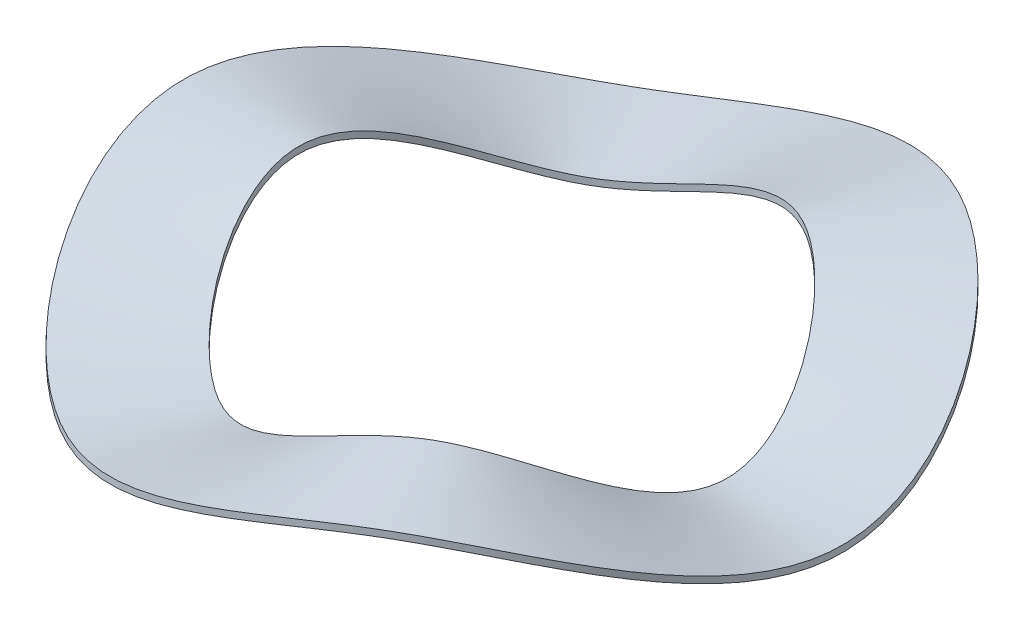
ISO-10303-21;
HEADER;
FILE_DESCRIPTION(('STEP AP214'),'2;1');
FILE_NAME('part.step','',(''),(''),'','','');
FILE_SCHEMA(('AUTOMOTIVE_DESIGN { 1 0 10303 214 1 1 1 1 }'));
ENDSEC;
DATA;
#1=APPLICATION_CONTEXT('core data for automotive mechanical design processes');
#2=APPLICATION_PROTOCOL_DEFINITION('international standard','automotive_design',2000,#1);
#3=PRODUCT_CONTEXT('',#1,'mechanical');
#4=PRODUCT('Part','Part','',(#3));
#5=PRODUCT_RELATED_PRODUCT_CATEGORY('part','',(#4));
#6=PRODUCT_DEFINITION_FORMATION('','',#4);
#7=PRODUCT_DEFINITION_CONTEXT('part definition',#1,'design');
#8=PRODUCT_DEFINITION('design','',#6,#7);
#9=PRODUCT_DEFINITION_SHAPE('','',#8);
#10=(LENGTH_UNIT() NAMED_UNIT(*) SI_UNIT(.MILLI.,.METRE.));
#11=(NAMED_UNIT(*) PLANE_ANGLE_UNIT() SI_UNIT($,.RADIAN.));
#12=(NAMED_UNIT(*) SI_UNIT($,.STERADIAN.) SOLID_ANGLE_UNIT());
#13=UNCERTAINTY_MEASURE_WITH_UNIT(LENGTH_MEASURE(1.E-05),#10,'distance_accuracy_value','');
#14=(GEOMETRIC_REPRESENTATION_CONTEXT(3) GLOBAL_UNCERTAINTY_ASSIGNED_CONTEXT((#13)) GLOBAL_UNIT_ASSIGNED_CONTEXT((#10,
#11,#12)) REPRESENTATION_CONTEXT('',''));
#15=CARTESIAN_POINT('',(0.,0.,0.));
#16=DIRECTION('',(0.,0.,1.));
#17=DIRECTION('',(1.,0.,0.));
#18=AXIS2_PLACEMENT_3D('',#15,#16,#17);
#19=CARTESIAN_POINT('',(3.25000000000007,1.2,5.62916512459881));
#20=CARTESIAN_POINT('',(5.19909186328009,1.19999999999999,4.50385641265875));
#21=CARTESIAN_POINT('',(7.79623482285323,-3.17660620268632,-0.000229722361054789));
#22=CARTESIAN_POINT('',(3.92223041859341,3.30525488927271,-6.74159863452586));
#23=CARTESIAN_POINT('',(-3.90372560645744,-2.84650951943813,-6.76145108919184));
#24=CARTESIAN_POINT('',(-7.79951088891458,3.30525488927271,0.0259518647351085));
#25=CARTESIAN_POINT('',(-3.89831635682703,-3.17660620268633,6.75162254927931));
#26=CARTESIAN_POINT('',(1.30090813672002,1.20000000000001,6.75447383653888));
#27=CARTESIAN_POINT('',(3.25000000000007,1.2,5.62916512459881));
#28=CARTESIAN_POINT('',(3.83333333333341,1.2,6.63952809568065));
#29=CARTESIAN_POINT('',(6.13226219771498,1.19999999999999,5.31224089698212));
#30=CARTESIAN_POINT('',(9.19555902182689,-3.17660620268632,-0.000270954579706861));
#31=CARTESIAN_POINT('',(4.62622049372556,3.30525488927271,-7.95162915867152));
#32=CARTESIAN_POINT('',(-4.60439430505236,-2.84650951943813,-7.97504487443141));
#33=CARTESIAN_POINT('',(-9.1994230997454,3.30525488927271,0.0306098917388469));
#34=CARTESIAN_POINT('',(-4.59801416446265,-3.17660620268633,7.96345223761149));
#35=CARTESIAN_POINT('',(1.53440446895182,1.20000000000001,7.9668152943792));
#36=CARTESIAN_POINT('',(3.83333333333341,1.2,6.63952809568065));
#37=CARTESIAN_POINT('',(4.41666666666676,1.2,7.64989106676249));
#38=CARTESIAN_POINT('',(7.06543253214987,1.19999999999999,6.12062538130548));
#39=CARTESIAN_POINT('',(10.5948832208005,-3.17660620268632,-0.000312186798357415));
#40=CARTESIAN_POINT('',(5.33021056885771,3.30525488927271,-9.16165968281719));
#41=CARTESIAN_POINT('',(-5.30506300364729,-2.84650951943813,-9.18863865967097));
#42=CARTESIAN_POINT('',(-10.5993353105762,3.30525488927271,0.0352679187425837));
#43=CARTESIAN_POINT('',(-5.29771197209827,-3.17660620268633,9.17528192594367));
#44=CARTESIAN_POINT('',(1.76790080118361,1.20000000000001,9.17915675221951));
#45=CARTESIAN_POINT('',(4.41666666666676,1.2,7.64989106676249));
#46=CARTESIAN_POINT('',(5.0000000000001,1.2,8.66025403784433));
#47=CARTESIAN_POINT('',(7.99860286658476,1.19999999999999,6.92900986562885));
#48=CARTESIAN_POINT('',(11.9942074197742,-3.17660620268632,-0.000353419017008402));
#49=CARTESIAN_POINT('',(6.03420064398986,3.30525488927271,-10.3716902069629));
#50=CARTESIAN_POINT('',(-6.00573170224222,-2.84650951943813,-10.4022324449105));
#51=CARTESIAN_POINT('',(-11.999247521407,3.30525488927271,0.039925945746322));
#52=CARTESIAN_POINT('',(-5.9974097797339,-3.17660620268633,10.3871116142759));
#53=CARTESIAN_POINT('',(2.00139713341541,1.20000000000001,10.3914982100598));
#54=CARTESIAN_POINT('',(5.0000000000001,1.2,8.66025403784433));
#55=B_SPLINE_SURFACE_WITH_KNOTS('',3,3,((#19,#20,#21,#22,#23,#24,#25,#26,#27),(#28,#29,#30,#31,
#32,#33,#34,#35,#36),(#37,#38,#39,#40,#41,#42,#43,#44,#45),(#46,#47,#48,#49,#50,#51,#52,#53,
#54)),.UNSPECIFIED.,.F.,.T.,.F.,(4,4),(4,1,1,1,1,1,4),(0.,1.),(0.,0.166997508378814,
0.333995016757629,0.499999999999999,0.666004983242369,0.833002491621184,1.),.UNSPECIFIED.);
#56=CARTESIAN_POINT('',(3.25000000000007,1.2,5.62916512459881));
#57=CARTESIAN_POINT('',(5.19909186328009,1.19999999999999,4.50385641265875));
#58=CARTESIAN_POINT('',(7.79623482285323,-3.17660620268632,-0.000229722361054789));
#59=CARTESIAN_POINT('',(3.92223041859341,3.30525488927271,-6.74159863452586));
#60=CARTESIAN_POINT('',(-3.90372560645744,-2.84650951943813,-6.76145108919184));
#61=CARTESIAN_POINT('',(-7.79951088891458,3.30525488927271,0.0259518647351085));
#62=CARTESIAN_POINT('',(-3.89831635682703,-3.17660620268633,6.75162254927931));
#63=CARTESIAN_POINT('',(1.30090813672002,1.20000000000001,6.75447383653888));
#64=CARTESIAN_POINT('',(3.25000000000007,1.2,5.62916512459881));
#65=B_SPLINE_CURVE_WITH_KNOTS('',3,(#56,#57,#58,#59,#60,#61,#62,#63,#64),.UNSPECIFIED.,.T.,.F.,
(4,1,1,1,1,1,4),(0.,0.166997508378814,0.333995016757629,0.499999999999999,0.666004983242369,
0.833002491621184,1.),.UNSPECIFIED.);
#66=CARTESIAN_POINT('',(3.25000000000007,1.2,5.62916512459881));
#67=VERTEX_POINT('',#66);
#68=EDGE_CURVE('E10',#67,#67,#65,.F.);
#69=CARTESIAN_POINT('',(5.0000000000001,1.2,8.66025403784433));
#70=CARTESIAN_POINT('',(7.99860286658476,1.19999999999999,6.92900986562885));
#71=CARTESIAN_POINT('',(11.9942074197742,-3.17660620268632,-0.000353419017008402));
#72=CARTESIAN_POINT('',(6.03420064398986,3.30525488927271,-10.3716902069629));
#73=CARTESIAN_POINT('',(-6.00573170224222,-2.84650951943813,-10.4022324449105));
#74=CARTESIAN_POINT('',(-11.999247521407,3.30525488927271,0.039925945746322));
#75=CARTESIAN_POINT('',(-5.9974097797339,-3.17660620268633,10.3871116142759));
#76=CARTESIAN_POINT('',(2.00139713341541,1.20000000000001,10.3914982100598));
#77=CARTESIAN_POINT('',(5.0000000000001,1.2,8.66025403784433));
#78=B_SPLINE_CURVE_WITH_KNOTS('',3,(#69,#70,#71,#72,#73,#74,#75,#76,#77),.UNSPECIFIED.,.T.,.F.,
(4,1,1,1,1,1,4),(0.,0.166997508378814,0.333995016757629,0.499999999999999,0.666004983242369,
0.833002491621184,1.),.UNSPECIFIED.);
#79=CARTESIAN_POINT('',(5.0000000000001,1.2,8.66025403784433));
#80=VERTEX_POINT('',#79);
#81=EDGE_CURVE('E351',#80,#80,#78,.T.);
#82=ORIENTED_EDGE('',*,*,#68,.T.);
#83=EDGE_LOOP('',(#82));
#84=FACE_BOUND('',#83,.T.);
#85=ORIENTED_EDGE('',*,*,#81,.T.);
#86=EDGE_LOOP('',(#85));
#87=FACE_BOUND('',#86,.T.);
#88=ADVANCED_FACE('F346',(#84,#87),#55,.T.);
#89=CARTESIAN_POINT('',(3.25000000000007,0.999999999999999,5.62916512459881));
#90=CARTESIAN_POINT('',(5.19909186328009,0.999999999999987,4.50385641265875));
#91=CARTESIAN_POINT('',(7.79623482285323,-3.37660620268632,-0.000229722361054681));
#92=CARTESIAN_POINT('',(3.92223041859341,3.10525488927271,-6.74159863452586));
#93=CARTESIAN_POINT('',(-3.90372560645744,-3.04650951943813,-6.76145108919184));
#94=CARTESIAN_POINT('',(-7.79951088891458,3.1052548892727,0.0259518647351081));
#95=CARTESIAN_POINT('',(-3.89831635682703,-3.37660620268633,6.75162254927931));
#96=CARTESIAN_POINT('',(1.30090813672002,1.00000000000001,6.75447383653888));
#97=CARTESIAN_POINT('',(3.25000000000007,0.999999999999999,5.62916512459881));
#98=CARTESIAN_POINT('',(3.25000000000007,1.06666666666667,5.62916512459881));
#99=CARTESIAN_POINT('',(5.19909186328009,1.06666666666665,4.50385641265875));
#100=CARTESIAN_POINT('',(7.79623482285323,-3.30993953601965,-0.000229722361054681));
#101=CARTESIAN_POINT('',(3.92223041859341,3.17192155593938,-6.74159863452586));
#102=CARTESIAN_POINT('',(-3.90372560645744,-2.97984285277147,-6.76145108919184));
#103=CARTESIAN_POINT('',(-7.79951088891458,3.17192155593937,0.0259518647351081));
#104=CARTESIAN_POINT('',(-3.89831635682703,-3.30993953601966,6.75162254927931));
#105=CARTESIAN_POINT('',(1.30090813672002,1.06666666666668,6.75447383653888));
#106=CARTESIAN_POINT('',(3.25000000000007,1.06666666666667,5.62916512459881));
#107=CARTESIAN_POINT('',(3.25000000000007,1.13333333333333,5.62916512459881));
#108=CARTESIAN_POINT('',(5.19909186328009,1.13333333333332,4.50385641265875));
#109=CARTESIAN_POINT('',(7.79623482285323,-3.24327286935299,-0.000229722361054681));
#110=CARTESIAN_POINT('',(3.92223041859341,3.23858822260604,-6.74159863452586));
#111=CARTESIAN_POINT('',(-3.90372560645744,-2.9131761861048,-6.76145108919184));
#112=CARTESIAN_POINT('',(-7.79951088891458,3.23858822260604,0.0259518647351081));
#113=CARTESIAN_POINT('',(-3.89831635682703,-3.243272869353,6.75162254927931));
#114=CARTESIAN_POINT('',(1.30090813672002,1.13333333333334,6.75447383653888));
#115=CARTESIAN_POINT('',(3.25000000000007,1.13333333333333,5.62916512459881));
#116=CARTESIAN_POINT('',(3.25000000000007,1.2,5.62916512459881));
#117=CARTESIAN_POINT('',(5.19909186328009,1.19999999999999,4.50385641265875));
#118=CARTESIAN_POINT('',(7.79623482285323,-3.17660620268632,-0.000229722361054789));
#119=CARTESIAN_POINT('',(3.92223041859341,3.30525488927271,-6.74159863452586));
#120=CARTESIAN_POINT('',(-3.90372560645744,-2.84650951943813,-6.76145108919184));
#121=CARTESIAN_POINT('',(-7.79951088891458,3.30525488927271,0.0259518647351085));
#122=CARTESIAN_POINT('',(-3.89831635682703,-3.17660620268633,6.75162254927931));
#123=CARTESIAN_POINT('',(1.30090813672002,1.20000000000001,6.75447383653888));
#124=CARTESIAN_POINT('',(3.25000000000007,1.2,5.62916512459881));
#125=B_SPLINE_SURFACE_WITH_KNOTS('',3,3,((#89,#90,#91,#92,#93,#94,#95,#96,#97),(#98,#99,#100,
#101,#102,#103,#104,#105,#106),(#107,#108,#109,#110,#111,#112,#113,#114,#115),(#116,#117,#118,
#119,#120,#121,#122,#123,#124)),.UNSPECIFIED.,.F.,.T.,.F.,(4,4),(4,1,1,1,1,1,4),(0.,1.),(0.,
0.166997508378814,0.333995016757629,0.499999999999999,0.666004983242369,0.833002491621184,1.),.UNSPECIFIED.);
#126=CARTESIAN_POINT('',(3.25000000000007,0.999999999999999,5.62916512459881));
#127=CARTESIAN_POINT('',(5.19909186328009,0.999999999999987,4.50385641265875));
#128=CARTESIAN_POINT('',(7.79623482285323,-3.37660620268632,-0.000229722361054681));
#129=CARTESIAN_POINT('',(3.92223041859341,3.10525488927271,-6.74159863452586));
#130=CARTESIAN_POINT('',(-3.90372560645744,-3.04650951943813,-6.76145108919184));
#131=CARTESIAN_POINT('',(-7.79951088891458,3.1052548892727,0.0259518647351081));
#132=CARTESIAN_POINT('',(-3.89831635682703,-3.37660620268633,6.75162254927931));
#133=CARTESIAN_POINT('',(1.30090813672002,1.00000000000001,6.75447383653888));
#134=CARTESIAN_POINT('',(3.25000000000007,0.999999999999999,5.62916512459881));
#135=B_SPLINE_CURVE_WITH_KNOTS('',3,(#126,#127,#128,#129,#130,#131,#132,#133,#134),
.UNSPECIFIED.,.T.,.F.,(4,1,1,1,1,1,4),(0.,0.166997508378814,0.333995016757629,0.499999999999999,
0.666004983242369,0.833002491621184,1.),.UNSPECIFIED.);
#136=CARTESIAN_POINT('',(3.25000000000007,0.999999999999999,5.62916512459881));
#137=VERTEX_POINT('',#136);
#138=EDGE_CURVE('E371',#137,#137,#135,.T.);
#139=ORIENTED_EDGE('',*,*,#138,.F.);
#140=EDGE_LOOP('',(#139));
#141=FACE_BOUND('',#140,.T.);
#142=ORIENTED_EDGE('',*,*,#68,.F.);
#143=EDGE_LOOP('',(#142));
#144=FACE_BOUND('',#143,.T.);
#145=ADVANCED_FACE('F385',(#141,#144),#125,.T.);
#146=CARTESIAN_POINT('',(5.0000000000001,1.2,8.66025403784433));
#147=CARTESIAN_POINT('',(7.99860286658476,1.19999999999999,6.92900986562885));
#148=CARTESIAN_POINT('',(11.9942074197742,-3.17660620268632,-0.000353419017008402));
#149=CARTESIAN_POINT('',(6.03420064398986,3.30525488927271,-10.3716902069629));
#150=CARTESIAN_POINT('',(-6.00573170224221,-2.84650951943813,-10.4022324449105));
#151=CARTESIAN_POINT('',(-11.999247521407,3.30525488927271,0.039925945746322));
#152=CARTESIAN_POINT('',(-5.9974097797339,-3.17660620268633,10.3871116142759));
#153=CARTESIAN_POINT('',(2.00139713341541,1.20000000000001,10.3914982100598));
#154=CARTESIAN_POINT('',(5.0000000000001,1.2,8.66025403784433));
#155=CARTESIAN_POINT('',(5.0000000000001,1.13333333333333,8.66025403784433));
#156=CARTESIAN_POINT('',(7.99860286658476,1.13333333333332,6.92900986562885));
#157=CARTESIAN_POINT('',(11.9942074197742,-3.24327286935299,-0.000353419017008402));
#158=CARTESIAN_POINT('',(6.03420064398986,3.23858822260604,-10.3716902069629));
#159=CARTESIAN_POINT('',(-6.00573170224221,-2.9131761861048,-10.4022324449105));
#160=CARTESIAN_POINT('',(-11.999247521407,3.23858822260604,0.039925945746322));
#161=CARTESIAN_POINT('',(-5.9974097797339,-3.243272869353,10.3871116142759));
#162=CARTESIAN_POINT('',(2.00139713341541,1.13333333333334,10.3914982100598));
#163=CARTESIAN_POINT('',(5.0000000000001,1.13333333333333,8.66025403784433));
#164=CARTESIAN_POINT('',(5.0000000000001,1.06666666666667,8.66025403784433));
#165=CARTESIAN_POINT('',(7.99860286658476,1.06666666666665,6.92900986562885));
#166=CARTESIAN_POINT('',(11.9942074197742,-3.30993953601965,-0.000353419017008402));
#167=CARTESIAN_POINT('',(6.03420064398986,3.17192155593938,-10.3716902069629));
#168=CARTESIAN_POINT('',(-6.00573170224221,-2.97984285277147,-10.4022324449105));
#169=CARTESIAN_POINT('',(-11.999247521407,3.17192155593937,0.039925945746322));
#170=CARTESIAN_POINT('',(-5.9974097797339,-3.30993953601966,10.3871116142759));
#171=CARTESIAN_POINT('',(2.00139713341541,1.06666666666668,10.3914982100598));
#172=CARTESIAN_POINT('',(5.0000000000001,1.06666666666667,8.66025403784433));
#173=CARTESIAN_POINT('',(5.0000000000001,0.999999999999999,8.66025403784433));
#174=CARTESIAN_POINT('',(7.99860286658476,0.999999999999987,6.92900986562885));
#175=CARTESIAN_POINT('',(11.9942074197742,-3.37660620268632,-0.000353419017008402));
#176=CARTESIAN_POINT('',(6.03420064398986,3.10525488927271,-10.3716902069629));
#177=CARTESIAN_POINT('',(-6.00573170224221,-3.04650951943813,-10.4022324449105));
#178=CARTESIAN_POINT('',(-11.999247521407,3.1052548892727,0.039925945746322));
#179=CARTESIAN_POINT('',(-5.9974097797339,-3.37660620268633,10.3871116142759));
#180=CARTESIAN_POINT('',(2.00139713341541,1.00000000000001,10.3914982100598));
#181=CARTESIAN_POINT('',(5.0000000000001,0.999999999999999,8.66025403784433));
#182=B_SPLINE_SURFACE_WITH_KNOTS('',3,3,((#146,#147,#148,#149,#150,#151,#152,#153,#154),(#155,
#156,#157,#158,#159,#160,#161,#162,#163),(#164,#165,#166,#167,#168,#169,#170,#171,#172),(#173,
#174,#175,#176,#177,#178,#179,#180,#181)),.UNSPECIFIED.,.F.,.T.,.F.,(4,4),(4,1,1,1,1,1,4),(0.,
1.),(0.,0.166997508378814,0.333995016757629,0.499999999999999,0.666004983242369,
0.833002491621184,1.),.UNSPECIFIED.);
#183=CARTESIAN_POINT('',(5.0000000000001,0.999999999999999,8.66025403784433));
#184=CARTESIAN_POINT('',(7.99860286658476,0.999999999999987,6.92900986562885));
#185=CARTESIAN_POINT('',(11.9942074197742,-3.37660620268632,-0.000353419017008402));
#186=CARTESIAN_POINT('',(6.03420064398986,3.10525488927271,-10.3716902069629));
#187=CARTESIAN_POINT('',(-6.00573170224221,-3.04650951943813,-10.4022324449105));
#188=CARTESIAN_POINT('',(-11.999247521407,3.1052548892727,0.039925945746322));
#189=CARTESIAN_POINT('',(-5.9974097797339,-3.37660620268633,10.3871116142759));
#190=CARTESIAN_POINT('',(2.00139713341541,1.00000000000001,10.3914982100598));
#191=CARTESIAN_POINT('',(5.0000000000001,0.999999999999999,8.66025403784433));
#192=B_SPLINE_CURVE_WITH_KNOTS('',3,(#183,#184,#185,#186,#187,#188,#189,#190,#191),
.UNSPECIFIED.,.T.,.F.,(4,1,1,1,1,1,4),(0.,0.166997508378814,0.333995016757629,0.499999999999999,
0.666004983242369,0.833002491621184,1.),.UNSPECIFIED.);
#193=CARTESIAN_POINT('',(5.0000000000001,0.999999999999999,8.66025403784433));
#194=VERTEX_POINT('',#193);
#195=EDGE_CURVE('E360',#194,#194,#192,.T.);
#196=ORIENTED_EDGE('',*,*,#81,.F.);
#197=EDGE_LOOP('',(#196));
#198=FACE_BOUND('',#197,.T.);
#199=ORIENTED_EDGE('',*,*,#195,.T.);
#200=EDGE_LOOP('',(#199));
#201=FACE_BOUND('',#200,.T.);
#202=ADVANCED_FACE('F388',(#198,#201),#182,.T.);
#203=CARTESIAN_POINT('',(5.0000000000001,0.999999999999999,8.66025403784433));
#204=CARTESIAN_POINT('',(7.99860286658476,0.999999999999987,6.92900986562885));
#205=CARTESIAN_POINT('',(11.9942074197742,-3.37660620268632,-0.000353419017008402));
#206=CARTESIAN_POINT('',(6.03420064398986,3.10525488927271,-10.3716902069629));
#207=CARTESIAN_POINT('',(-6.00573170224222,-3.04650951943813,-10.4022324449105));
#208=CARTESIAN_POINT('',(-11.999247521407,3.1052548892727,0.039925945746322));
#209=CARTESIAN_POINT('',(-5.9974097797339,-3.37660620268633,10.3871116142759));
#210=CARTESIAN_POINT('',(2.00139713341541,1.00000000000001,10.3914982100598));
#211=CARTESIAN_POINT('',(5.0000000000001,0.999999999999999,8.66025403784433));
#212=CARTESIAN_POINT('',(4.41666666666676,0.999999999999999,7.64989106676249));
#213=CARTESIAN_POINT('',(7.06543253214987,0.999999999999987,6.12062538130548));
#214=CARTESIAN_POINT('',(10.5948832208006,-3.37660620268632,-0.000312186798356764));
#215=CARTESIAN_POINT('',(5.33021056885771,3.10525488927271,-9.16165968281719));
#216=CARTESIAN_POINT('',(-5.30506300364729,-3.04650951943813,-9.18863865967097));
#217=CARTESIAN_POINT('',(-10.5993353105762,3.1052548892727,0.0352679187425837));
#218=CARTESIAN_POINT('',(-5.29771197209828,-3.37660620268633,9.17528192594367));
#219=CARTESIAN_POINT('',(1.76790080118361,1.00000000000001,9.17915675221951));
#220=CARTESIAN_POINT('',(4.41666666666676,0.999999999999999,7.64989106676249));
#221=CARTESIAN_POINT('',(3.83333333333341,0.999999999999999,6.63952809568065));
#222=CARTESIAN_POINT('',(6.13226219771498,0.999999999999987,5.31224089698212));
#223=CARTESIAN_POINT('',(9.19555902182689,-3.37660620268632,-0.000270954579705994));
#224=CARTESIAN_POINT('',(4.62622049372556,3.10525488927271,-7.95162915867152));
#225=CARTESIAN_POINT('',(-4.60439430505236,-3.04650951943813,-7.97504487443141));
#226=CARTESIAN_POINT('',(-9.1994230997454,3.1052548892727,0.0306098917388463));
#227=CARTESIAN_POINT('',(-4.59801416446265,-3.37660620268633,7.96345223761149));
#228=CARTESIAN_POINT('',(1.53440446895182,1.00000000000001,7.9668152943792));
#229=CARTESIAN_POINT('',(3.83333333333341,0.999999999999999,6.63952809568065));
#230=CARTESIAN_POINT('',(3.25000000000007,0.999999999999999,5.62916512459881));
#231=CARTESIAN_POINT('',(5.19909186328009,0.999999999999987,4.50385641265875));
#232=CARTESIAN_POINT('',(7.79623482285323,-3.37660620268632,-0.000229722361054681));
#233=CARTESIAN_POINT('',(3.92223041859341,3.10525488927271,-6.74159863452586));
#234=CARTESIAN_POINT('',(-3.90372560645744,-3.04650951943813,-6.76145108919184));
#235=CARTESIAN_POINT('',(-7.79951088891458,3.1052548892727,0.0259518647351081));
#236=CARTESIAN_POINT('',(-3.89831635682703,-3.37660620268633,6.75162254927931));
#237=CARTESIAN_POINT('',(1.30090813672002,1.00000000000001,6.75447383653888));
#238=CARTESIAN_POINT('',(3.25000000000007,0.999999999999999,5.62916512459881));
#239=B_SPLINE_SURFACE_WITH_KNOTS('',3,3,((#203,#204,#205,#206,#207,#208,#209,#210,#211),(#212,
#213,#214,#215,#216,#217,#218,#219,#220),(#221,#222,#223,#224,#225,#226,#227,#228,#229),(#230,
#231,#232,#233,#234,#235,#236,#237,#238)),.UNSPECIFIED.,.F.,.T.,.F.,(4,4),(4,1,1,1,1,1,4),(0.,
1.),(0.,0.166997508378814,0.333995016757629,0.499999999999999,0.666004983242369,
0.833002491621184,1.),.UNSPECIFIED.);
#240=ORIENTED_EDGE('',*,*,#195,.F.);
#241=EDGE_LOOP('',(#240));
#242=FACE_BOUND('',#241,.T.);
#243=ORIENTED_EDGE('',*,*,#138,.T.);
#244=EDGE_LOOP('',(#243));
#245=FACE_BOUND('',#244,.T.);
#246=ADVANCED_FACE('F383',(#242,#245),#239,.T.);
#247=CLOSED_SHELL('',(#88,#145,#202,#246));
#248=MANIFOLD_SOLID_BREP('B2',#247);
#249=ADVANCED_BREP_SHAPE_REPRESENTATION('',(#18,#248),#14);
#250=SHAPE_DEFINITION_REPRESENTATION(#9,#249);
ENDSEC;
END-ISO-10303-21;
